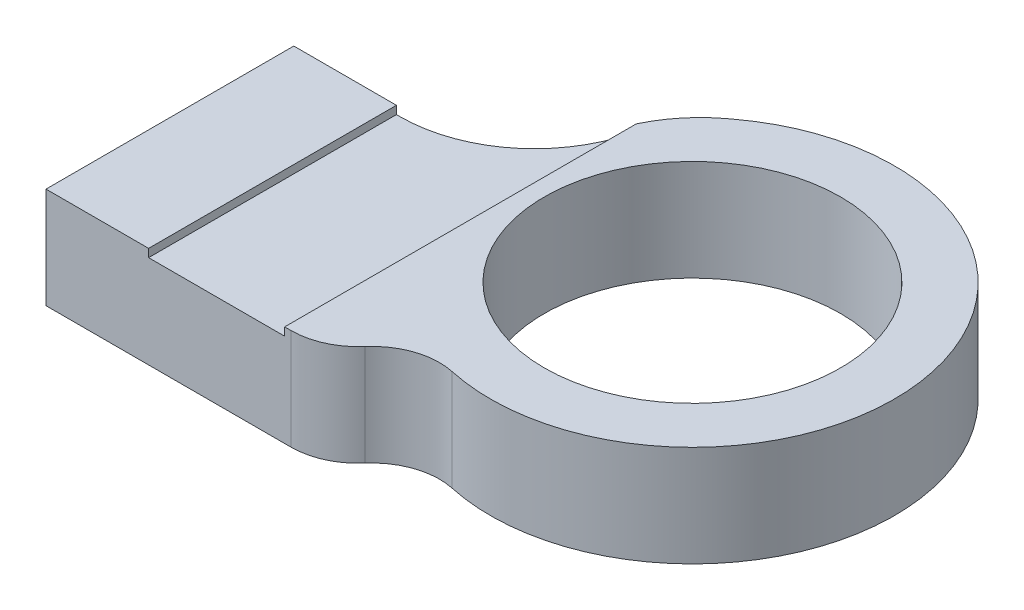
ISO-10303-21;
HEADER;
FILE_DESCRIPTION(('STEP AP214'),'2;1');
FILE_NAME('part.step','',(''),(''),'','','');
FILE_SCHEMA(('AUTOMOTIVE_DESIGN { 1 0 10303 214 1 1 1 1 }'));
ENDSEC;
DATA;
#1=APPLICATION_CONTEXT('core data for automotive mechanical design processes');
#2=APPLICATION_PROTOCOL_DEFINITION('international standard','automotive_design',2000,#1);
#3=PRODUCT_CONTEXT('',#1,'mechanical');
#4=PRODUCT('Part','Part','',(#3));
#5=PRODUCT_RELATED_PRODUCT_CATEGORY('part','',(#4));
#6=PRODUCT_DEFINITION_FORMATION('','',#4);
#7=PRODUCT_DEFINITION_CONTEXT('part definition',#1,'design');
#8=PRODUCT_DEFINITION('design','',#6,#7);
#9=PRODUCT_DEFINITION_SHAPE('','',#8);
#10=(LENGTH_UNIT() NAMED_UNIT(*) SI_UNIT(.MILLI.,.METRE.));
#11=(NAMED_UNIT(*) PLANE_ANGLE_UNIT() SI_UNIT($,.RADIAN.));
#12=(NAMED_UNIT(*) SI_UNIT($,.STERADIAN.) SOLID_ANGLE_UNIT());
#13=UNCERTAINTY_MEASURE_WITH_UNIT(LENGTH_MEASURE(1.E-05),#10,'distance_accuracy_value','');
#14=(GEOMETRIC_REPRESENTATION_CONTEXT(3) GLOBAL_UNCERTAINTY_ASSIGNED_CONTEXT((#13)) GLOBAL_UNIT_ASSIGNED_CONTEXT((#10,
#11,#12)) REPRESENTATION_CONTEXT('',''));
#15=CARTESIAN_POINT('',(0.,0.,0.));
#16=DIRECTION('',(0.,0.,1.));
#17=DIRECTION('',(1.,0.,0.));
#18=AXIS2_PLACEMENT_3D('',#15,#16,#17);
#19=CARTESIAN_POINT('',(0.,1.9,0.));
#20=DIRECTION('',(0.,-1.,0.));
#21=DIRECTION('',(0.,0.,-1.));
#22=AXIS2_PLACEMENT_3D('',#19,#20,#21);
#23=PLANE('',#22);
#24=DIRECTION('',(0.,0.,-1.));
#25=VECTOR('',#24,1.);
#26=CARTESIAN_POINT('',(-12.2803398874989,1.9,18.));
#27=LINE('',#26,#25);
#28=CARTESIAN_POINT('',(-12.2803398874989,1.9,18.));
#29=VERTEX_POINT('',#28);
#30=CARTESIAN_POINT('',(-12.2803398874989,1.9,-8.10913451879451));
#31=VERTEX_POINT('',#30);
#32=EDGE_CURVE('E268',#29,#31,#27,.T.);
#33=ORIENTED_EDGE('',*,*,#32,.T.);
#34=CARTESIAN_POINT('',(-3.2484944658867,1.9,-3.8166098211251));
#35=DIRECTION('',(0.,-1.,0.));
#36=DIRECTION('',(0.,0.,-1.));
#37=AXIS2_PLACEMENT_3D('',#34,#35,#36);
#38=CIRCLE('',#37,10.);
#39=CARTESIAN_POINT('',(-12.6912029458819,1.9,-7.10830491056255));
#40=VERTEX_POINT('',#39);
#41=EDGE_CURVE('E11',#31,#40,#38,.F.);
#42=ORIENTED_EDGE('',*,*,#41,.T.);
#43=CARTESIAN_POINT('',(-22.1339114258771,1.9,-10.4));
#44=DIRECTION('',(0.,-1.,0.));
#45=DIRECTION('',(0.,0.,-1.));
#46=AXIS2_PLACEMENT_3D('',#43,#44,#45);
#47=CIRCLE('',#46,10.);
#48=CARTESIAN_POINT('',(-22.1339114258771,1.9,-0.399999999999998));
#49=VERTEX_POINT('',#48);
#50=EDGE_CURVE('E236',#40,#49,#47,.T.);
#51=ORIENTED_EDGE('',*,*,#50,.T.);
#52=DIRECTION('',(-1.,0.,0.));
#53=VECTOR('',#52,1.);
#54=CARTESIAN_POINT('',(0.,1.9,-0.399999999999998));
#55=LINE('',#54,#53);
#56=CARTESIAN_POINT('',(-22.3803398874989,1.9,-0.399999999999998));
#57=VERTEX_POINT('',#56);
#58=EDGE_CURVE('E164',#49,#57,#55,.T.);
#59=ORIENTED_EDGE('',*,*,#58,.T.);
#60=DIRECTION('',(0.,0.,-1.));
#61=VECTOR('',#60,1.);
#62=CARTESIAN_POINT('',(-22.3803398874989,1.9,-2.));
#63=LINE('',#62,#61);
#64=CARTESIAN_POINT('',(-22.3803398874989,1.9,18.));
#65=VERTEX_POINT('',#64);
#66=EDGE_CURVE('E316',#65,#57,#63,.T.);
#67=ORIENTED_EDGE('',*,*,#66,.F.);
#68=DIRECTION('',(-1.,0.,0.));
#69=VECTOR('',#68,1.);
#70=CARTESIAN_POINT('',(-23.8803398874989,1.9,18.));
#71=LINE('',#70,#69);
#72=EDGE_CURVE('E292',#29,#65,#71,.T.);
#73=ORIENTED_EDGE('',*,*,#72,.F.);
#74=EDGE_LOOP('',(#33,#42,#51,#59,#67,#73));
#75=FACE_BOUND('',#74,.T.);
#76=ADVANCED_FACE('F45',(#75),#23,.F.);
#77=CARTESIAN_POINT('',(0.,2.5,0.));
#78=DIRECTION('',(0.,-1.,0.));
#79=DIRECTION('',(0.,0.,-1.));
#80=AXIS2_PLACEMENT_3D('',#77,#78,#79);
#81=CYLINDRICAL_SURFACE('',#80,15.);
#82=CARTESIAN_POINT('',(0.,2.5,0.));
#83=DIRECTION('',(0.,1.,0.));
#84=DIRECTION('',(0.,0.,1.));
#85=AXIS2_PLACEMENT_3D('',#82,#83,#84);
#86=CIRCLE('',#85,15.);
#87=CARTESIAN_POINT('',(-3.1833752096446,2.5,14.6583123951777));
#88=VERTEX_POINT('',#87);
#89=CARTESIAN_POINT('',(-9.,2.5,-12.));
#90=VERTEX_POINT('',#89);
#91=EDGE_CURVE('E191',#88,#90,#86,.T.);
#92=ORIENTED_EDGE('',*,*,#91,.F.);
#93=DIRECTION('',(0.,-1.,0.));
#94=VECTOR('',#93,1.);
#95=CARTESIAN_POINT('',(-3.1833752096446,2.5,14.6583123951777));
#96=LINE('',#95,#94);
#97=CARTESIAN_POINT('',(-3.1833752096446,-5.,14.6583123951777));
#98=VERTEX_POINT('',#97);
#99=EDGE_CURVE('E206',#88,#98,#96,.T.);
#100=ORIENTED_EDGE('',*,*,#99,.T.);
#101=CARTESIAN_POINT('',(0.,-5.,0.));
#102=DIRECTION('',(0.,-1.,0.));
#103=DIRECTION('',(0.,0.,-1.));
#104=AXIS2_PLACEMENT_3D('',#101,#102,#103);
#105=CIRCLE('',#104,15.);
#106=CARTESIAN_POINT('',(-9.,-5.,-12.));
#107=VERTEX_POINT('',#106);
#108=EDGE_CURVE('E178',#107,#98,#105,.T.);
#109=ORIENTED_EDGE('',*,*,#108,.F.);
#110=DIRECTION('',(0.,-1.,0.));
#111=VECTOR('',#110,1.);
#112=CARTESIAN_POINT('',(-9.,2.5,-12.));
#113=LINE('',#112,#111);
#114=EDGE_CURVE('E196',#107,#90,#113,.F.);
#115=ORIENTED_EDGE('',*,*,#114,.T.);
#116=EDGE_LOOP('',(#92,#100,#109,#115));
#117=FACE_BOUND('',#116,.T.);
#118=ADVANCED_FACE('F273',(#117),#81,.T.);
#119=CARTESIAN_POINT('',(0.,2.5,0.));
#120=DIRECTION('',(0.,1.,0.));
#121=DIRECTION('',(0.,0.,1.));
#122=AXIS2_PLACEMENT_3D('',#119,#120,#121);
#123=PLANE('',#122);
#124=DIRECTION('',(1.,0.,0.));
#125=VECTOR('',#124,1.);
#126=CARTESIAN_POINT('',(-30.,2.5,-0.399999999999998));
#127=LINE('',#126,#125);
#128=CARTESIAN_POINT('',(-30.,2.5,-0.399999999999998));
#129=VERTEX_POINT('',#128);
#130=CARTESIAN_POINT('',(-22.3803398874989,2.5,-0.399999999999998));
#131=VERTEX_POINT('',#130);
#132=EDGE_CURVE('E154',#129,#131,#127,.T.);
#133=ORIENTED_EDGE('',*,*,#132,.F.);
#134=DIRECTION('',(0.,0.,1.));
#135=VECTOR('',#134,1.);
#136=CARTESIAN_POINT('',(-30.,2.5,10.));
#137=LINE('',#136,#135);
#138=CARTESIAN_POINT('',(-30.,2.5,18.));
#139=VERTEX_POINT('',#138);
#140=EDGE_CURVE('E162',#129,#139,#137,.T.);
#141=ORIENTED_EDGE('',*,*,#140,.T.);
#142=DIRECTION('',(-1.,0.,0.));
#143=VECTOR('',#142,1.);
#144=CARTESIAN_POINT('',(-30.,2.5,18.));
#145=LINE('',#144,#143);
#146=CARTESIAN_POINT('',(-22.3803398874989,2.5,18.));
#147=VERTEX_POINT('',#146);
#148=EDGE_CURVE('E180',#147,#139,#145,.T.);
#149=ORIENTED_EDGE('',*,*,#148,.F.);
#150=DIRECTION('',(0.,0.,-1.));
#151=VECTOR('',#150,1.);
#152=CARTESIAN_POINT('',(-22.3803398874989,2.5,-2.));
#153=LINE('',#152,#151);
#154=EDGE_CURVE('E309',#147,#131,#153,.T.);
#155=ORIENTED_EDGE('',*,*,#154,.T.);
#156=EDGE_LOOP('',(#133,#141,#149,#155));
#157=FACE_BOUND('',#156,.T.);
#158=ADVANCED_FACE('F308',(#157),#123,.T.);
#159=CARTESIAN_POINT('',(-30.,2.5,10.));
#160=DIRECTION('',(1.,0.,0.));
#161=DIRECTION('',(0.,0.,-1.));
#162=AXIS2_PLACEMENT_3D('',#159,#160,#161);
#163=PLANE('',#162);
#164=ORIENTED_EDGE('',*,*,#140,.F.);
#165=DIRECTION('',(0.,1.,0.));
#166=VECTOR('',#165,1.);
#167=CARTESIAN_POINT('',(-30.,-5.,-0.399999999999998));
#168=LINE('',#167,#166);
#169=CARTESIAN_POINT('',(-30.,-5.,-0.399999999999998));
#170=VERTEX_POINT('',#169);
#171=EDGE_CURVE('E145',#170,#129,#168,.T.);
#172=ORIENTED_EDGE('',*,*,#171,.F.);
#173=DIRECTION('',(0.,0.,-1.));
#174=VECTOR('',#173,1.);
#175=CARTESIAN_POINT('',(-30.,-5.,10.));
#176=LINE('',#175,#174);
#177=CARTESIAN_POINT('',(-30.,-5.,18.));
#178=VERTEX_POINT('',#177);
#179=EDGE_CURVE('E160',#178,#170,#176,.T.);
#180=ORIENTED_EDGE('',*,*,#179,.F.);
#181=DIRECTION('',(0.,-1.,0.));
#182=VECTOR('',#181,1.);
#183=CARTESIAN_POINT('',(-30.,-5.,18.));
#184=LINE('',#183,#182);
#185=EDGE_CURVE('E173',#139,#178,#184,.T.);
#186=ORIENTED_EDGE('',*,*,#185,.F.);
#187=EDGE_LOOP('',(#164,#172,#180,#186));
#188=FACE_BOUND('',#187,.T.);
#189=ADVANCED_FACE('F158',(#188),#163,.F.);
#190=CARTESIAN_POINT('',(-15.,2.5,-20.));
#191=DIRECTION('',(0.,1.,0.));
#192=DIRECTION('',(0.,0.,1.));
#193=AXIS2_PLACEMENT_3D('',#190,#191,#192);
#194=CIRCLE('',#193,10.);
#195=CARTESIAN_POINT('',(-9.12424723294335,2.5,-11.9083049105626));
#196=VERTEX_POINT('',#195);
#197=EDGE_CURVE('E203',#90,#196,#194,.F.);
#198=ORIENTED_EDGE('',*,*,#197,.T.);
#199=CARTESIAN_POINT('',(-3.2484944658867,2.5,-3.8166098211251));
#200=DIRECTION('',(0.,1.,0.));
#201=DIRECTION('',(0.,0.,1.));
#202=AXIS2_PLACEMENT_3D('',#199,#200,#201);
#203=CIRCLE('',#202,10.);
#204=CARTESIAN_POINT('',(-12.2803398874989,2.5,-8.10913451879451));
#205=VERTEX_POINT('',#204);
#206=EDGE_CURVE('E68',#196,#205,#203,.T.);
#207=ORIENTED_EDGE('',*,*,#206,.T.);
#208=DIRECTION('',(0.,0.,-1.));
#209=VECTOR('',#208,1.);
#210=CARTESIAN_POINT('',(-12.2803398874989,2.5,18.));
#211=LINE('',#210,#209);
#212=CARTESIAN_POINT('',(-12.2803398874989,2.5,18.));
#213=VERTEX_POINT('',#212);
#214=EDGE_CURVE('E290',#213,#205,#211,.T.);
#215=ORIENTED_EDGE('',*,*,#214,.F.);
#216=DIRECTION('',(-1.,0.,0.));
#217=VECTOR('',#216,1.);
#218=CARTESIAN_POINT('',(-13.8803398874989,2.5,18.));
#219=LINE('',#218,#217);
#220=CARTESIAN_POINT('',(-11.8056253494077,2.5,18.));
#221=VERTEX_POINT('',#220);
#222=EDGE_CURVE('E289',#221,#213,#219,.T.);
#223=ORIENTED_EDGE('',*,*,#222,.F.);
#224=CARTESIAN_POINT('',(-11.8056253494077,2.5,13.));
#225=DIRECTION('',(0.,1.,0.));
#226=DIRECTION('',(0.,0.,1.));
#227=AXIS2_PLACEMENT_3D('',#224,#225,#226);
#228=CIRCLE('',#227,5.);
#229=CARTESIAN_POINT('',(-8.0250628144669,2.5,16.2722082634518));
#230=VERTEX_POINT('',#229);
#231=EDGE_CURVE('E221',#221,#230,#228,.T.);
#232=ORIENTED_EDGE('',*,*,#231,.T.);
#233=CARTESIAN_POINT('',(-4.24450027952613,2.5,19.5444165269036));
#234=DIRECTION('',(0.,1.,0.));
#235=DIRECTION('',(0.,0.,1.));
#236=AXIS2_PLACEMENT_3D('',#233,#234,#235);
#237=CIRCLE('',#236,5.);
#238=EDGE_CURVE('E214',#230,#88,#237,.F.);
#239=ORIENTED_EDGE('',*,*,#238,.T.);
#240=ORIENTED_EDGE('',*,*,#91,.T.);
#241=EDGE_LOOP('',(#198,#207,#215,#223,#232,#239,#240));
#242=FACE_BOUND('',#241,.T.);
#243=CARTESIAN_POINT('',(0.,2.5,0.));
#244=DIRECTION('',(0.,1.,0.));
#245=DIRECTION('',(0.,0.,1.));
#246=AXIS2_PLACEMENT_3D('',#243,#244,#245);
#247=CIRCLE('',#246,11.);
#248=CARTESIAN_POINT('',(0.,2.5,11.));
#249=VERTEX_POINT('',#248);
#250=EDGE_CURVE('E187',#249,#249,#247,.T.);
#251=ORIENTED_EDGE('',*,*,#250,.F.);
#252=EDGE_LOOP('',(#251));
#253=FACE_BOUND('',#252,.T.);
#254=ADVANCED_FACE('F261',(#242,#253),#123,.T.);
#255=CARTESIAN_POINT('',(0.,0.,0.));
#256=DIRECTION('',(0.,1.,0.));
#257=DIRECTION('',(0.,0.,1.));
#258=AXIS2_PLACEMENT_3D('',#255,#256,#257);
#259=CYLINDRICAL_SURFACE('',#258,11.);
#260=ORIENTED_EDGE('',*,*,#250,.T.);
#261=EDGE_LOOP('',(#260));
#262=FACE_BOUND('',#261,.T.);
#263=CARTESIAN_POINT('',(0.,-5.,0.));
#264=DIRECTION('',(0.,1.,0.));
#265=DIRECTION('',(0.,0.,1.));
#266=AXIS2_PLACEMENT_3D('',#263,#264,#265);
#267=CIRCLE('',#266,11.);
#268=CARTESIAN_POINT('',(0.,-5.,11.));
#269=VERTEX_POINT('',#268);
#270=EDGE_CURVE('E172',#269,#269,#267,.T.);
#271=ORIENTED_EDGE('',*,*,#270,.F.);
#272=EDGE_LOOP('',(#271));
#273=FACE_BOUND('',#272,.T.);
#274=ADVANCED_FACE('F349',(#262,#273),#259,.F.);
#275=CARTESIAN_POINT('',(0.,-5.,0.));
#276=DIRECTION('',(0.,-1.,0.));
#277=DIRECTION('',(0.,0.,-1.));
#278=AXIS2_PLACEMENT_3D('',#275,#276,#277);
#279=PLANE('',#278);
#280=CARTESIAN_POINT('',(-22.1339114258771,-5.,-10.4));
#281=DIRECTION('',(0.,-1.,0.));
#282=DIRECTION('',(0.,0.,-1.));
#283=AXIS2_PLACEMENT_3D('',#280,#281,#282);
#284=CIRCLE('',#283,10.);
#285=CARTESIAN_POINT('',(-22.1339114258771,-5.,-0.399999999999998));
#286=VERTEX_POINT('',#285);
#287=CARTESIAN_POINT('',(-12.6912029458819,-5.,-7.10830491056255));
#288=VERTEX_POINT('',#287);
#289=EDGE_CURVE('E239',#286,#288,#284,.F.);
#290=ORIENTED_EDGE('',*,*,#289,.T.);
#291=CARTESIAN_POINT('',(-3.2484944658867,-5.,-3.8166098211251));
#292=DIRECTION('',(0.,-1.,0.));
#293=DIRECTION('',(0.,0.,-1.));
#294=AXIS2_PLACEMENT_3D('',#291,#292,#293);
#295=CIRCLE('',#294,10.);
#296=CARTESIAN_POINT('',(-9.12424723294336,-5.,-11.9083049105625));
#297=VERTEX_POINT('',#296);
#298=EDGE_CURVE('E246',#288,#297,#295,.T.);
#299=ORIENTED_EDGE('',*,*,#298,.T.);
#300=CARTESIAN_POINT('',(-15.,-5.,-20.));
#301=DIRECTION('',(0.,-1.,0.));
#302=DIRECTION('',(0.,0.,-1.));
#303=AXIS2_PLACEMENT_3D('',#300,#301,#302);
#304=CIRCLE('',#303,10.);
#305=EDGE_CURVE('E200',#297,#107,#304,.F.);
#306=ORIENTED_EDGE('',*,*,#305,.T.);
#307=ORIENTED_EDGE('',*,*,#108,.T.);
#308=CARTESIAN_POINT('',(-4.24450027952613,-5.,19.5444165269036));
#309=DIRECTION('',(0.,-1.,0.));
#310=DIRECTION('',(0.,0.,-1.));
#311=AXIS2_PLACEMENT_3D('',#308,#309,#310);
#312=CIRCLE('',#311,5.);
#313=CARTESIAN_POINT('',(-8.0250628144669,-5.,16.2722082634518));
#314=VERTEX_POINT('',#313);
#315=EDGE_CURVE('E210',#98,#314,#312,.F.);
#316=ORIENTED_EDGE('',*,*,#315,.T.);
#317=CARTESIAN_POINT('',(-11.8056253494077,-5.,13.));
#318=DIRECTION('',(0.,-1.,0.));
#319=DIRECTION('',(0.,0.,-1.));
#320=AXIS2_PLACEMENT_3D('',#317,#318,#319);
#321=CIRCLE('',#320,5.);
#322=CARTESIAN_POINT('',(-11.8056253494077,-5.,18.));
#323=VERTEX_POINT('',#322);
#324=EDGE_CURVE('E227',#314,#323,#321,.T.);
#325=ORIENTED_EDGE('',*,*,#324,.T.);
#326=DIRECTION('',(1.,0.,0.));
#327=VECTOR('',#326,1.);
#328=CARTESIAN_POINT('',(-9.,-5.,18.));
#329=LINE('',#328,#327);
#330=EDGE_CURVE('E170',#178,#323,#329,.T.);
#331=ORIENTED_EDGE('',*,*,#330,.F.);
#332=ORIENTED_EDGE('',*,*,#179,.T.);
#333=DIRECTION('',(1.,0.,0.));
#334=VECTOR('',#333,1.);
#335=CARTESIAN_POINT('',(-30.,-5.,-0.399999999999998));
#336=LINE('',#335,#334);
#337=EDGE_CURVE('E141',#170,#286,#336,.T.);
#338=ORIENTED_EDGE('',*,*,#337,.T.);
#339=EDGE_LOOP('',(#290,#299,#306,#307,#316,#325,#331,#332,#338));
#340=FACE_BOUND('',#339,.T.);
#341=ORIENTED_EDGE('',*,*,#270,.T.);
#342=EDGE_LOOP('',(#341));
#343=FACE_BOUND('',#342,.T.);
#344=ADVANCED_FACE('F167',(#340,#343),#279,.T.);
#345=CARTESIAN_POINT('',(-15.,2.5,-20.));
#346=DIRECTION('',(0.,-1.,0.));
#347=DIRECTION('',(0.,0.,-1.));
#348=AXIS2_PLACEMENT_3D('',#345,#346,#347);
#349=CYLINDRICAL_SURFACE('',#348,10.);
#350=ORIENTED_EDGE('',*,*,#305,.F.);
#351=DIRECTION('',(0.,-1.,0.));
#352=VECTOR('',#351,1.);
#353=CARTESIAN_POINT('',(-9.12424723294335,2.5,-11.9083049105626));
#354=LINE('',#353,#352);
#355=EDGE_CURVE('E249',#297,#196,#354,.F.);
#356=ORIENTED_EDGE('',*,*,#355,.T.);
#357=ORIENTED_EDGE('',*,*,#197,.F.);
#358=ORIENTED_EDGE('',*,*,#114,.F.);
#359=EDGE_LOOP('',(#350,#356,#357,#358));
#360=FACE_BOUND('',#359,.T.);
#361=ADVANCED_FACE('F258',(#360),#349,.F.);
#362=CARTESIAN_POINT('',(0.,0.,18.));
#363=DIRECTION('',(0.,0.,-1.));
#364=DIRECTION('',(-1.,0.,0.));
#365=AXIS2_PLACEMENT_3D('',#362,#363,#364);
#366=PLANE('',#365);
#367=DIRECTION('',(0.,-1.,0.));
#368=VECTOR('',#367,1.);
#369=CARTESIAN_POINT('',(-22.3803398874989,2.5,18.));
#370=LINE('',#369,#368);
#371=EDGE_CURVE('E304',#147,#65,#370,.T.);
#372=ORIENTED_EDGE('',*,*,#371,.F.);
#373=ORIENTED_EDGE('',*,*,#148,.T.);
#374=ORIENTED_EDGE('',*,*,#185,.T.);
#375=ORIENTED_EDGE('',*,*,#330,.T.);
#376=DIRECTION('',(0.,1.,0.));
#377=VECTOR('',#376,1.);
#378=CARTESIAN_POINT('',(-11.8056253494077,0.,18.));
#379=LINE('',#378,#377);
#380=EDGE_CURVE('E217',#323,#221,#379,.T.);
#381=ORIENTED_EDGE('',*,*,#380,.T.);
#382=ORIENTED_EDGE('',*,*,#222,.T.);
#383=DIRECTION('',(0.,1.,0.));
#384=VECTOR('',#383,1.);
#385=CARTESIAN_POINT('',(-12.2803398874989,1.9,18.));
#386=LINE('',#385,#384);
#387=EDGE_CURVE('E298',#29,#213,#386,.T.);
#388=ORIENTED_EDGE('',*,*,#387,.F.);
#389=ORIENTED_EDGE('',*,*,#72,.T.);
#390=EDGE_LOOP('',(#372,#373,#374,#375,#381,#382,#388,#389));
#391=FACE_BOUND('',#390,.T.);
#392=ADVANCED_FACE('F287',(#391),#366,.F.);
#393=CARTESIAN_POINT('',(-4.24450027952613,2.5,19.5444165269036));
#394=DIRECTION('',(0.,1.,0.));
#395=DIRECTION('',(0.,0.,1.));
#396=AXIS2_PLACEMENT_3D('',#393,#394,#395);
#397=CYLINDRICAL_SURFACE('',#396,5.);
#398=ORIENTED_EDGE('',*,*,#238,.F.);
#399=DIRECTION('',(0.,1.,0.));
#400=VECTOR('',#399,1.);
#401=CARTESIAN_POINT('',(-8.0250628144669,2.5,16.2722082634518));
#402=LINE('',#401,#400);
#403=EDGE_CURVE('E224',#230,#314,#402,.F.);
#404=ORIENTED_EDGE('',*,*,#403,.T.);
#405=ORIENTED_EDGE('',*,*,#315,.F.);
#406=ORIENTED_EDGE('',*,*,#99,.F.);
#407=EDGE_LOOP('',(#398,#404,#405,#406));
#408=FACE_BOUND('',#407,.T.);
#409=ADVANCED_FACE('F277',(#408),#397,.F.);
#410=CARTESIAN_POINT('',(-11.8056253494077,2.5,13.));
#411=DIRECTION('',(0.,1.,0.));
#412=DIRECTION('',(0.,0.,1.));
#413=AXIS2_PLACEMENT_3D('',#410,#411,#412);
#414=CYLINDRICAL_SURFACE('',#413,5.);
#415=ORIENTED_EDGE('',*,*,#324,.F.);
#416=ORIENTED_EDGE('',*,*,#403,.F.);
#417=ORIENTED_EDGE('',*,*,#231,.F.);
#418=ORIENTED_EDGE('',*,*,#380,.F.);
#419=EDGE_LOOP('',(#415,#416,#417,#418));
#420=FACE_BOUND('',#419,.T.);
#421=ADVANCED_FACE('F282',(#420),#414,.T.);
#422=CARTESIAN_POINT('',(-12.2803398874989,1.9,18.));
#423=DIRECTION('',(1.,0.,0.));
#424=DIRECTION('',(0.,0.,-1.));
#425=AXIS2_PLACEMENT_3D('',#422,#423,#424);
#426=PLANE('',#425);
#427=ORIENTED_EDGE('',*,*,#214,.T.);
#428=DIRECTION('',(0.,-1.,0.));
#429=VECTOR('',#428,1.);
#430=CARTESIAN_POINT('',(-12.2803398874989,2.5,-8.10913451879451));
#431=LINE('',#430,#429);
#432=EDGE_CURVE('E54',#205,#31,#431,.T.);
#433=ORIENTED_EDGE('',*,*,#432,.T.);
#434=ORIENTED_EDGE('',*,*,#32,.F.);
#435=ORIENTED_EDGE('',*,*,#387,.T.);
#436=EDGE_LOOP('',(#427,#433,#434,#435));
#437=FACE_BOUND('',#436,.T.);
#438=ADVANCED_FACE('F328',(#437),#426,.F.);
#439=CARTESIAN_POINT('',(-22.3803398874989,2.5,-2.));
#440=DIRECTION('',(-1.,0.,0.));
#441=DIRECTION('',(0.,0.,1.));
#442=AXIS2_PLACEMENT_3D('',#439,#440,#441);
#443=PLANE('',#442);
#444=ORIENTED_EDGE('',*,*,#66,.T.);
#445=DIRECTION('',(0.,1.,0.));
#446=VECTOR('',#445,1.);
#447=CARTESIAN_POINT('',(-22.3803398874989,2.5,-0.399999999999998));
#448=LINE('',#447,#446);
#449=EDGE_CURVE('E230',#57,#131,#448,.T.);
#450=ORIENTED_EDGE('',*,*,#449,.T.);
#451=ORIENTED_EDGE('',*,*,#154,.F.);
#452=ORIENTED_EDGE('',*,*,#371,.T.);
#453=EDGE_LOOP('',(#444,#450,#451,#452));
#454=FACE_BOUND('',#453,.T.);
#455=ADVANCED_FACE('F330',(#454),#443,.F.);
#456=CARTESIAN_POINT('',(-30.,-5.,-0.399999999999998));
#457=DIRECTION('',(0.,0.,1.));
#458=DIRECTION('',(1.,0.,0.));
#459=AXIS2_PLACEMENT_3D('',#456,#457,#458);
#460=PLANE('',#459);
#461=ORIENTED_EDGE('',*,*,#58,.F.);
#462=DIRECTION('',(0.,-1.,0.));
#463=VECTOR('',#462,1.);
#464=CARTESIAN_POINT('',(-22.1339114258771,-5.,-0.399999999999998));
#465=LINE('',#464,#463);
#466=EDGE_CURVE('E148',#49,#286,#465,.T.);
#467=ORIENTED_EDGE('',*,*,#466,.T.);
#468=ORIENTED_EDGE('',*,*,#337,.F.);
#469=ORIENTED_EDGE('',*,*,#171,.T.);
#470=ORIENTED_EDGE('',*,*,#132,.T.);
#471=ORIENTED_EDGE('',*,*,#449,.F.);
#472=EDGE_LOOP('',(#461,#467,#468,#469,#470,#471));
#473=FACE_BOUND('',#472,.T.);
#474=ADVANCED_FACE('F144',(#473),#460,.F.);
#475=CARTESIAN_POINT('',(-22.1339114258771,2.5,-10.4));
#476=DIRECTION('',(0.,-1.,0.));
#477=DIRECTION('',(0.,0.,-1.));
#478=AXIS2_PLACEMENT_3D('',#475,#476,#477);
#479=CYLINDRICAL_SURFACE('',#478,10.);
#480=ORIENTED_EDGE('',*,*,#50,.F.);
#481=DIRECTION('',(0.,-1.,0.));
#482=VECTOR('',#481,1.);
#483=CARTESIAN_POINT('',(-12.6912029458819,2.5,-7.10830491056255));
#484=LINE('',#483,#482);
#485=EDGE_CURVE('E242',#40,#288,#484,.T.);
#486=ORIENTED_EDGE('',*,*,#485,.T.);
#487=ORIENTED_EDGE('',*,*,#289,.F.);
#488=ORIENTED_EDGE('',*,*,#466,.F.);
#489=EDGE_LOOP('',(#480,#486,#487,#488));
#490=FACE_BOUND('',#489,.T.);
#491=ADVANCED_FACE('F270',(#490),#479,.F.);
#492=CARTESIAN_POINT('',(-3.2484944658867,2.5,-3.8166098211251));
#493=DIRECTION('',(0.,-1.,0.));
#494=DIRECTION('',(0.,0.,-1.));
#495=AXIS2_PLACEMENT_3D('',#492,#493,#494);
#496=CYLINDRICAL_SURFACE('',#495,10.);
#497=ORIENTED_EDGE('',*,*,#206,.F.);
#498=ORIENTED_EDGE('',*,*,#355,.F.);
#499=ORIENTED_EDGE('',*,*,#298,.F.);
#500=ORIENTED_EDGE('',*,*,#485,.F.);
#501=ORIENTED_EDGE('',*,*,#41,.F.);
#502=ORIENTED_EDGE('',*,*,#432,.F.);
#503=EDGE_LOOP('',(#497,#498,#499,#500,#501,#502));
#504=FACE_BOUND('',#503,.T.);
#505=ADVANCED_FACE('F47',(#504),#496,.T.);
#506=CLOSED_SHELL('',(#76,#118,#158,#189,#254,#274,#344,#361,#392,#409,#421,#438,#455,#474,#491,#505));
#507=MANIFOLD_SOLID_BREP('B2',#506);
#508=ADVANCED_BREP_SHAPE_REPRESENTATION('',(#18,#507),#14);
#509=SHAPE_DEFINITION_REPRESENTATION(#9,#508);
ENDSEC;
END-ISO-10303-21;
